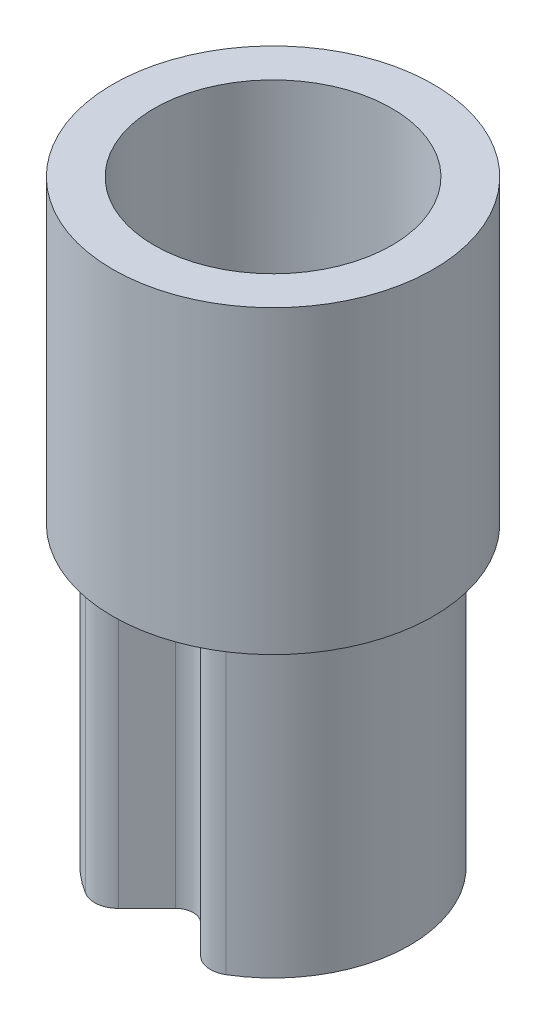
ISO-10303-21;
HEADER;
FILE_DESCRIPTION(('STEP AP214'),'2;1');
FILE_NAME('part.step','',(''),(''),'','','');
FILE_SCHEMA(('AUTOMOTIVE_DESIGN { 1 0 10303 214 1 1 1 1 }'));
ENDSEC;
DATA;
#1=APPLICATION_CONTEXT('core data for automotive mechanical design processes');
#2=APPLICATION_PROTOCOL_DEFINITION('international standard','automotive_design',2000,#1);
#3=PRODUCT_CONTEXT('',#1,'mechanical');
#4=PRODUCT('Part','Part','',(#3));
#5=PRODUCT_RELATED_PRODUCT_CATEGORY('part','',(#4));
#6=PRODUCT_DEFINITION_FORMATION('','',#4);
#7=PRODUCT_DEFINITION_CONTEXT('part definition',#1,'design');
#8=PRODUCT_DEFINITION('design','',#6,#7);
#9=PRODUCT_DEFINITION_SHAPE('','',#8);
#10=(LENGTH_UNIT() NAMED_UNIT(*) SI_UNIT(.MILLI.,.METRE.));
#11=(NAMED_UNIT(*) PLANE_ANGLE_UNIT() SI_UNIT($,.RADIAN.));
#12=(NAMED_UNIT(*) SI_UNIT($,.STERADIAN.) SOLID_ANGLE_UNIT());
#13=UNCERTAINTY_MEASURE_WITH_UNIT(LENGTH_MEASURE(1.E-05),#10,'distance_accuracy_value','');
#14=(GEOMETRIC_REPRESENTATION_CONTEXT(3) GLOBAL_UNCERTAINTY_ASSIGNED_CONTEXT((#13)) GLOBAL_UNIT_ASSIGNED_CONTEXT((#10,
#11,#12)) REPRESENTATION_CONTEXT('',''));
#15=CARTESIAN_POINT('',(0.,0.,0.));
#16=DIRECTION('',(0.,0.,1.));
#17=DIRECTION('',(1.,0.,0.));
#18=AXIS2_PLACEMENT_3D('',#15,#16,#17);
#19=CARTESIAN_POINT('',(0.,2.5,0.822132034355964));
#20=DIRECTION('',(0.,1.,0.));
#21=DIRECTION('',(0.,0.,1.));
#22=AXIS2_PLACEMENT_3D('',#19,#20,#21);
#23=PLANE('',#22);
#24=DIRECTION('',(0.707106781186548,0.,0.707106781186548));
#25=VECTOR('',#24,1.);
#26=CARTESIAN_POINT('',(0.106066017177983,2.5,0.716066017177983));
#27=LINE('',#26,#25);
#28=CARTESIAN_POINT('',(0.106066017177983,2.5,0.716066017177983));
#29=VERTEX_POINT('',#28);
#30=CARTESIAN_POINT('',(0.332945922473057,2.5,0.942945922473057));
#31=VERTEX_POINT('',#30);
#32=EDGE_CURVE('E155',#29,#31,#27,.T.);
#33=ORIENTED_EDGE('',*,*,#32,.T.);
#34=CARTESIAN_POINT('',(0.,2.5,0.));
#35=DIRECTION('',(0.,1.,0.));
#36=DIRECTION('',(0.,0.,1.));
#37=AXIS2_PLACEMENT_3D('',#34,#35,#36);
#38=CIRCLE('',#37,1.);
#39=CARTESIAN_POINT('',(0.513633561053512,2.5,0.858009653185492));
#40=VERTEX_POINT('',#39);
#41=EDGE_CURVE('E138',#31,#40,#38,.T.);
#42=ORIENTED_EDGE('',*,*,#41,.T.);
#43=CARTESIAN_POINT('',(0.487951883000837,2.5,0.815109170526217));
#44=DIRECTION('',(0.,1.,0.));
#45=DIRECTION('',(0.,0.,1.));
#46=AXIS2_PLACEMENT_3D('',#43,#44,#45);
#47=CIRCLE('',#46,0.05);
#48=CARTESIAN_POINT('',(0.452596543941509,2.5,0.850464509585545));
#49=VERTEX_POINT('',#48);
#50=EDGE_CURVE('E195',#40,#49,#47,.F.);
#51=ORIENTED_EDGE('',*,*,#50,.T.);
#52=DIRECTION('',(0.707106781186548,0.,0.707106781186547));
#53=VECTOR('',#52,1.);
#54=CARTESIAN_POINT('',(0.212132034355966,2.5,0.610000000000001));
#55=LINE('',#54,#53);
#56=CARTESIAN_POINT('',(0.212132034355966,2.5,0.610000000000002));
#57=VERTEX_POINT('',#56);
#58=EDGE_CURVE('E228',#57,#49,#55,.T.);
#59=ORIENTED_EDGE('',*,*,#58,.F.);
#60=CARTESIAN_POINT('',(0.,2.5,0.822132034355964));
#61=DIRECTION('',(0.,-1.,0.));
#62=DIRECTION('',(0.,0.,1.));
#63=AXIS2_PLACEMENT_3D('',#60,#61,#62);
#64=CIRCLE('',#63,0.3);
#65=CARTESIAN_POINT('',(-0.212132034355965,2.5,0.610000000000001));
#66=VERTEX_POINT('',#65);
#67=EDGE_CURVE('E224',#66,#57,#64,.T.);
#68=ORIENTED_EDGE('',*,*,#67,.F.);
#69=DIRECTION('',(0.707106781186547,0.,-0.707106781186548));
#70=VECTOR('',#69,1.);
#71=CARTESIAN_POINT('',(-0.479612456619358,2.5,0.877480422263394));
#72=LINE('',#71,#70);
#73=CARTESIAN_POINT('',(-0.452596543941509,2.5,0.850464509585545));
#74=VERTEX_POINT('',#73);
#75=EDGE_CURVE('E222',#74,#66,#72,.T.);
#76=ORIENTED_EDGE('',*,*,#75,.F.);
#77=CARTESIAN_POINT('',(-0.487951883000836,2.5,0.815109170526218));
#78=DIRECTION('',(0.,1.,0.));
#79=DIRECTION('',(0.,0.,1.));
#80=AXIS2_PLACEMENT_3D('',#77,#78,#79);
#81=CIRCLE('',#80,0.05);
#82=CARTESIAN_POINT('',(-0.513633561053512,2.5,0.858009653185492));
#83=VERTEX_POINT('',#82);
#84=EDGE_CURVE('E198',#74,#83,#81,.F.);
#85=ORIENTED_EDGE('',*,*,#84,.T.);
#86=CARTESIAN_POINT('',(-0.332945922473057,2.5,0.942945922473057));
#87=VERTEX_POINT('',#86);
#88=EDGE_CURVE('E12',#83,#87,#38,.T.);
#89=ORIENTED_EDGE('',*,*,#88,.T.);
#90=DIRECTION('',(0.707106781186547,0.,-0.707106781186548));
#91=VECTOR('',#90,1.);
#92=CARTESIAN_POINT('',(-0.448807004477936,2.5,1.05880700447794));
#93=LINE('',#92,#91);
#94=CARTESIAN_POINT('',(-0.106066017177983,2.5,0.716066017177983));
#95=VERTEX_POINT('',#94);
#96=EDGE_CURVE('E165',#87,#95,#93,.T.);
#97=ORIENTED_EDGE('',*,*,#96,.T.);
#98=CARTESIAN_POINT('',(0.,2.5,0.822132034355964));
#99=DIRECTION('',(0.,-1.,0.));
#100=DIRECTION('',(0.,0.,1.));
#101=AXIS2_PLACEMENT_3D('',#98,#99,#100);
#102=CIRCLE('',#101,0.15);
#103=EDGE_CURVE('E160',#95,#29,#102,.T.);
#104=ORIENTED_EDGE('',*,*,#103,.T.);
#105=EDGE_LOOP('',(#33,#42,#51,#59,#68,#76,#85,#89,#97,#104));
#106=FACE_BOUND('',#105,.T.);
#107=ADVANCED_FACE('F37',(#106),#23,.T.);
#108=CARTESIAN_POINT('',(0.,0.,0.822132034355964));
#109=DIRECTION('',(0.,1.,0.));
#110=DIRECTION('',(0.,0.,1.));
#111=AXIS2_PLACEMENT_3D('',#108,#109,#110);
#112=PLANE('',#111);
#113=CARTESIAN_POINT('',(0.,0.,0.));
#114=DIRECTION('',(0.,1.,0.));
#115=DIRECTION('',(0.,0.,1.));
#116=AXIS2_PLACEMENT_3D('',#113,#114,#115);
#117=CIRCLE('',#116,1.15);
#118=CARTESIAN_POINT('',(0.590678595211539,0.,0.986711101163316));
#119=VERTEX_POINT('',#118);
#120=CARTESIAN_POINT('',(-0.590678595211538,0.,0.986711101163316));
#121=VERTEX_POINT('',#120);
#122=EDGE_CURVE('E178',#119,#121,#117,.T.);
#123=ORIENTED_EDGE('',*,*,#122,.F.);
#124=CARTESIAN_POINT('',(0.487951883000836,0.,0.815109170526217));
#125=DIRECTION('',(0.,1.,0.));
#126=DIRECTION('',(0.,0.,1.));
#127=AXIS2_PLACEMENT_3D('',#124,#125,#126);
#128=CIRCLE('',#127,0.2);
#129=CARTESIAN_POINT('',(0.346530526763527,0.,0.956530526763527));
#130=VERTEX_POINT('',#129);
#131=EDGE_CURVE('E62',#119,#130,#128,.F.);
#132=ORIENTED_EDGE('',*,*,#131,.T.);
#133=DIRECTION('',(0.707106781186548,0.,0.707106781186548));
#134=VECTOR('',#133,1.);
#135=CARTESIAN_POINT('',(0.106066017177983,0.,0.716066017177983));
#136=LINE('',#135,#134);
#137=CARTESIAN_POINT('',(0.106066017177983,0.,0.716066017177983));
#138=VERTEX_POINT('',#137);
#139=EDGE_CURVE('E175',#138,#130,#136,.T.);
#140=ORIENTED_EDGE('',*,*,#139,.F.);
#141=CARTESIAN_POINT('',(0.,0.,0.822132034355964));
#142=DIRECTION('',(0.,-1.,0.));
#143=DIRECTION('',(0.,0.,1.));
#144=AXIS2_PLACEMENT_3D('',#141,#142,#143);
#145=CIRCLE('',#144,0.15);
#146=CARTESIAN_POINT('',(-0.106066017177983,0.,0.716066017177983));
#147=VERTEX_POINT('',#146);
#148=EDGE_CURVE('E172',#147,#138,#145,.T.);
#149=ORIENTED_EDGE('',*,*,#148,.F.);
#150=DIRECTION('',(0.707106781186547,0.,-0.707106781186548));
#151=VECTOR('',#150,1.);
#152=CARTESIAN_POINT('',(-0.448807004477936,0.,1.05880700447794));
#153=LINE('',#152,#151);
#154=CARTESIAN_POINT('',(-0.346530526763527,0.,0.956530526763527));
#155=VERTEX_POINT('',#154);
#156=EDGE_CURVE('E181',#155,#147,#153,.T.);
#157=ORIENTED_EDGE('',*,*,#156,.F.);
#158=CARTESIAN_POINT('',(-0.487951883000836,0.,0.815109170526218));
#159=DIRECTION('',(0.,1.,0.));
#160=DIRECTION('',(0.,0.,1.));
#161=AXIS2_PLACEMENT_3D('',#158,#159,#160);
#162=CIRCLE('',#161,0.2);
#163=EDGE_CURVE('E205',#155,#121,#162,.F.);
#164=ORIENTED_EDGE('',*,*,#163,.T.);
#165=EDGE_LOOP('',(#123,#132,#140,#149,#157,#164));
#166=FACE_BOUND('',#165,.T.);
#167=DIRECTION('',(0.707106781186548,0.,0.707106781186547));
#168=VECTOR('',#167,1.);
#169=CARTESIAN_POINT('',(0.212132034355966,0.,0.610000000000001));
#170=LINE('',#169,#168);
#171=CARTESIAN_POINT('',(0.212132034355966,0.,0.610000000000002));
#172=VERTEX_POINT('',#171);
#173=CARTESIAN_POINT('',(0.452596543941509,0.,0.850464509585545));
#174=VERTEX_POINT('',#173);
#175=EDGE_CURVE('E225',#172,#174,#170,.T.);
#176=ORIENTED_EDGE('',*,*,#175,.T.);
#177=CARTESIAN_POINT('',(0.487951883000837,0.,0.815109170526217));
#178=DIRECTION('',(0.,1.,0.));
#179=DIRECTION('',(0.,0.,1.));
#180=AXIS2_PLACEMENT_3D('',#177,#178,#179);
#181=CIRCLE('',#180,0.05);
#182=CARTESIAN_POINT('',(0.513633561053512,0.,0.858009653185492));
#183=VERTEX_POINT('',#182);
#184=EDGE_CURVE('E193',#174,#183,#181,.T.);
#185=ORIENTED_EDGE('',*,*,#184,.T.);
#186=CARTESIAN_POINT('',(0.,0.,0.));
#187=DIRECTION('',(0.,1.,0.));
#188=DIRECTION('',(0.,0.,1.));
#189=AXIS2_PLACEMENT_3D('',#186,#187,#188);
#190=CIRCLE('',#189,1.);
#191=CARTESIAN_POINT('',(-0.513633561053512,0.,0.858009653185492));
#192=VERTEX_POINT('',#191);
#193=EDGE_CURVE('E232',#183,#192,#190,.T.);
#194=ORIENTED_EDGE('',*,*,#193,.T.);
#195=CARTESIAN_POINT('',(-0.487951883000836,0.,0.815109170526218));
#196=DIRECTION('',(0.,1.,0.));
#197=DIRECTION('',(0.,0.,1.));
#198=AXIS2_PLACEMENT_3D('',#195,#196,#197);
#199=CIRCLE('',#198,0.05);
#200=CARTESIAN_POINT('',(-0.452596543941509,0.,0.850464509585545));
#201=VERTEX_POINT('',#200);
#202=EDGE_CURVE('E196',#192,#201,#199,.T.);
#203=ORIENTED_EDGE('',*,*,#202,.T.);
#204=DIRECTION('',(0.707106781186547,0.,-0.707106781186548));
#205=VECTOR('',#204,1.);
#206=CARTESIAN_POINT('',(-0.479612456619358,0.,0.877480422263394));
#207=LINE('',#206,#205);
#208=CARTESIAN_POINT('',(-0.212132034355965,0.,0.610000000000001));
#209=VERTEX_POINT('',#208);
#210=EDGE_CURVE('E235',#201,#209,#207,.T.);
#211=ORIENTED_EDGE('',*,*,#210,.T.);
#212=CARTESIAN_POINT('',(0.,0.,0.822132034355964));
#213=DIRECTION('',(0.,-1.,0.));
#214=DIRECTION('',(0.,0.,1.));
#215=AXIS2_PLACEMENT_3D('',#212,#213,#214);
#216=CIRCLE('',#215,0.3);
#217=EDGE_CURVE('E238',#209,#172,#216,.T.);
#218=ORIENTED_EDGE('',*,*,#217,.T.);
#219=EDGE_LOOP('',(#176,#185,#194,#203,#211,#218));
#220=FACE_BOUND('',#219,.T.);
#221=ADVANCED_FACE('F256',(#166,#220),#112,.F.);
#222=CARTESIAN_POINT('',(0.,2.5,0.822132034355964));
#223=DIRECTION('',(0.,-1.,0.));
#224=DIRECTION('',(0.,0.,-1.));
#225=AXIS2_PLACEMENT_3D('',#222,#223,#224);
#226=CYLINDRICAL_SURFACE('',#225,0.15);
#227=ORIENTED_EDGE('',*,*,#148,.T.);
#228=DIRECTION('',(0.,-1.,0.));
#229=VECTOR('',#228,1.);
#230=CARTESIAN_POINT('',(0.106066017177983,2.5,0.716066017177983));
#231=LINE('',#230,#229);
#232=EDGE_CURVE('E185',#29,#138,#231,.T.);
#233=ORIENTED_EDGE('',*,*,#232,.F.);
#234=ORIENTED_EDGE('',*,*,#103,.F.);
#235=DIRECTION('',(0.,-1.,0.));
#236=VECTOR('',#235,1.);
#237=CARTESIAN_POINT('',(-0.106066017177983,2.5,0.716066017177983));
#238=LINE('',#237,#236);
#239=EDGE_CURVE('E171',#95,#147,#238,.T.);
#240=ORIENTED_EDGE('',*,*,#239,.T.);
#241=EDGE_LOOP('',(#227,#233,#234,#240));
#242=FACE_BOUND('',#241,.T.);
#243=ADVANCED_FACE('F292',(#242),#226,.F.);
#244=CARTESIAN_POINT('',(0.106066017177983,2.5,0.716066017177983));
#245=DIRECTION('',(0.707106781186547,0.,-0.707106781186547));
#246=DIRECTION('',(-0.707106781186548,0.,-0.707106781186548));
#247=AXIS2_PLACEMENT_3D('',#244,#245,#246);
#248=PLANE('',#247);
#249=ORIENTED_EDGE('',*,*,#139,.T.);
#250=DIRECTION('',(0.,-1.,0.));
#251=VECTOR('',#250,1.);
#252=CARTESIAN_POINT('',(0.346530526763527,2.5,0.956530526763527));
#253=LINE('',#252,#251);
#254=CARTESIAN_POINT('',(0.346530526763527,2.5,0.956530526763527));
#255=VERTEX_POINT('',#254);
#256=EDGE_CURVE('E158',#130,#255,#253,.F.);
#257=ORIENTED_EDGE('',*,*,#256,.T.);
#258=EDGE_CURVE('E134',#31,#255,#27,.T.);
#259=ORIENTED_EDGE('',*,*,#258,.F.);
#260=ORIENTED_EDGE('',*,*,#32,.F.);
#261=ORIENTED_EDGE('',*,*,#232,.T.);
#262=EDGE_LOOP('',(#249,#257,#259,#260,#261));
#263=FACE_BOUND('',#262,.T.);
#264=ADVANCED_FACE('F153',(#263),#248,.F.);
#265=CARTESIAN_POINT('',(0.,2.5,0.));
#266=DIRECTION('',(0.,-1.,0.));
#267=DIRECTION('',(0.,0.,-1.));
#268=AXIS2_PLACEMENT_3D('',#265,#266,#267);
#269=CYLINDRICAL_SURFACE('',#268,1.15);
#270=CARTESIAN_POINT('',(0.,2.5,0.));
#271=DIRECTION('',(0.,1.,0.));
#272=DIRECTION('',(0.,0.,1.));
#273=AXIS2_PLACEMENT_3D('',#270,#271,#272);
#274=CIRCLE('',#273,1.15);
#275=CARTESIAN_POINT('',(0.590678595211539,2.5,0.986711101163316));
#276=VERTEX_POINT('',#275);
#277=CARTESIAN_POINT('',(-0.590678595211538,2.5,0.986711101163316));
#278=VERTEX_POINT('',#277);
#279=EDGE_CURVE('E164',#276,#278,#274,.T.);
#280=ORIENTED_EDGE('',*,*,#279,.F.);
#281=DIRECTION('',(0.,-1.,0.));
#282=VECTOR('',#281,1.);
#283=CARTESIAN_POINT('',(0.590678595211539,2.5,0.986711101163316));
#284=LINE('',#283,#282);
#285=EDGE_CURVE('E202',#276,#119,#284,.T.);
#286=ORIENTED_EDGE('',*,*,#285,.T.);
#287=ORIENTED_EDGE('',*,*,#122,.T.);
#288=DIRECTION('',(0.,-1.,0.));
#289=VECTOR('',#288,1.);
#290=CARTESIAN_POINT('',(-0.590678595211539,2.5,0.986711101163316));
#291=LINE('',#290,#289);
#292=EDGE_CURVE('E199',#121,#278,#291,.F.);
#293=ORIENTED_EDGE('',*,*,#292,.T.);
#294=EDGE_LOOP('',(#280,#286,#287,#293));
#295=FACE_BOUND('',#294,.T.);
#296=ADVANCED_FACE('F300',(#295),#269,.T.);
#297=CARTESIAN_POINT('',(-0.448807004477936,2.5,1.05880700447794));
#298=DIRECTION('',(-0.707106781186548,0.,-0.707106781186547));
#299=DIRECTION('',(-0.707106781186547,0.,0.707106781186548));
#300=AXIS2_PLACEMENT_3D('',#297,#298,#299);
#301=PLANE('',#300);
#302=CARTESIAN_POINT('',(-0.346530526763527,2.5,0.956530526763527));
#303=VERTEX_POINT('',#302);
#304=EDGE_CURVE('E137',#303,#87,#93,.T.);
#305=ORIENTED_EDGE('',*,*,#304,.F.);
#306=DIRECTION('',(0.,-1.,0.));
#307=VECTOR('',#306,1.);
#308=CARTESIAN_POINT('',(-0.346530526763527,2.5,0.956530526763527));
#309=LINE('',#308,#307);
#310=EDGE_CURVE('E46',#303,#155,#309,.T.);
#311=ORIENTED_EDGE('',*,*,#310,.T.);
#312=ORIENTED_EDGE('',*,*,#156,.T.);
#313=ORIENTED_EDGE('',*,*,#239,.F.);
#314=ORIENTED_EDGE('',*,*,#96,.F.);
#315=EDGE_LOOP('',(#305,#311,#312,#313,#314));
#316=FACE_BOUND('',#315,.T.);
#317=ADVANCED_FACE('F297',(#316),#301,.F.);
#318=CARTESIAN_POINT('',(0.,2.5,0.));
#319=DIRECTION('',(0.,-1.,0.));
#320=DIRECTION('',(0.,0.,-1.));
#321=AXIS2_PLACEMENT_3D('',#318,#319,#320);
#322=CYLINDRICAL_SURFACE('',#321,1.);
#323=ORIENTED_EDGE('',*,*,#193,.F.);
#324=DIRECTION('',(0.,-1.,0.));
#325=VECTOR('',#324,1.);
#326=CARTESIAN_POINT('',(0.513633561053512,2.5,0.858009653185492));
#327=LINE('',#326,#325);
#328=EDGE_CURVE('E146',#183,#40,#327,.F.);
#329=ORIENTED_EDGE('',*,*,#328,.T.);
#330=ORIENTED_EDGE('',*,*,#41,.F.);
#331=EDGE_CURVE('E54',#87,#31,#38,.T.);
#332=ORIENTED_EDGE('',*,*,#331,.F.);
#333=ORIENTED_EDGE('',*,*,#88,.F.);
#334=DIRECTION('',(0.,-1.,0.));
#335=VECTOR('',#334,1.);
#336=CARTESIAN_POINT('',(-0.513633561053512,2.5,0.858009653185492));
#337=LINE('',#336,#335);
#338=EDGE_CURVE('E190',#83,#192,#337,.T.);
#339=ORIENTED_EDGE('',*,*,#338,.T.);
#340=EDGE_LOOP('',(#323,#329,#330,#332,#333,#339));
#341=FACE_BOUND('',#340,.T.);
#342=CARTESIAN_POINT('',(0.,5.03,0.));
#343=DIRECTION('',(0.,1.,0.));
#344=DIRECTION('',(0.,0.,1.));
#345=AXIS2_PLACEMENT_3D('',#342,#343,#344);
#346=CIRCLE('',#345,1.);
#347=CARTESIAN_POINT('',(0.,5.03,1.));
#348=VERTEX_POINT('',#347);
#349=EDGE_CURVE('E139',#348,#348,#346,.T.);
#350=ORIENTED_EDGE('',*,*,#349,.T.);
#351=EDGE_LOOP('',(#350));
#352=FACE_BOUND('',#351,.T.);
#353=ADVANCED_FACE('F143',(#341,#352),#322,.F.);
#354=CARTESIAN_POINT('',(-0.479612456619358,2.5,0.877480422263394));
#355=DIRECTION('',(-0.707106781186548,0.,-0.707106781186547));
#356=DIRECTION('',(-0.707106781186547,0.,0.707106781186548));
#357=AXIS2_PLACEMENT_3D('',#354,#355,#356);
#358=PLANE('',#357);
#359=ORIENTED_EDGE('',*,*,#210,.F.);
#360=DIRECTION('',(0.,1.,0.));
#361=VECTOR('',#360,1.);
#362=CARTESIAN_POINT('',(-0.452596543941509,2.5,0.850464509585545));
#363=LINE('',#362,#361);
#364=EDGE_CURVE('E191',#201,#74,#363,.T.);
#365=ORIENTED_EDGE('',*,*,#364,.T.);
#366=ORIENTED_EDGE('',*,*,#75,.T.);
#367=DIRECTION('',(0.,-1.,0.));
#368=VECTOR('',#367,1.);
#369=CARTESIAN_POINT('',(-0.212132034355965,2.5,0.610000000000001));
#370=LINE('',#369,#368);
#371=EDGE_CURVE('E176',#66,#209,#370,.T.);
#372=ORIENTED_EDGE('',*,*,#371,.T.);
#373=EDGE_LOOP('',(#359,#365,#366,#372));
#374=FACE_BOUND('',#373,.T.);
#375=ADVANCED_FACE('F248',(#374),#358,.T.);
#376=CARTESIAN_POINT('',(0.,2.5,0.822132034355964));
#377=DIRECTION('',(0.,-1.,0.));
#378=DIRECTION('',(0.,0.,-1.));
#379=AXIS2_PLACEMENT_3D('',#376,#377,#378);
#380=CYLINDRICAL_SURFACE('',#379,0.3);
#381=ORIENTED_EDGE('',*,*,#217,.F.);
#382=ORIENTED_EDGE('',*,*,#371,.F.);
#383=ORIENTED_EDGE('',*,*,#67,.T.);
#384=DIRECTION('',(0.,-1.,0.));
#385=VECTOR('',#384,1.);
#386=CARTESIAN_POINT('',(0.212132034355966,2.5,0.610000000000002));
#387=LINE('',#386,#385);
#388=EDGE_CURVE('E231',#57,#172,#387,.T.);
#389=ORIENTED_EDGE('',*,*,#388,.T.);
#390=EDGE_LOOP('',(#381,#382,#383,#389));
#391=FACE_BOUND('',#390,.T.);
#392=ADVANCED_FACE('F253',(#391),#380,.T.);
#393=CARTESIAN_POINT('',(0.212132034355966,2.5,0.610000000000001));
#394=DIRECTION('',(0.707106781186547,0.,-0.707106781186548));
#395=DIRECTION('',(-0.707106781186548,0.,-0.707106781186547));
#396=AXIS2_PLACEMENT_3D('',#393,#394,#395);
#397=PLANE('',#396);
#398=ORIENTED_EDGE('',*,*,#58,.T.);
#399=DIRECTION('',(0.,1.,0.));
#400=VECTOR('',#399,1.);
#401=CARTESIAN_POINT('',(0.452596543941509,0.,0.850464509585545));
#402=LINE('',#401,#400);
#403=EDGE_CURVE('E187',#49,#174,#402,.F.);
#404=ORIENTED_EDGE('',*,*,#403,.T.);
#405=ORIENTED_EDGE('',*,*,#175,.F.);
#406=ORIENTED_EDGE('',*,*,#388,.F.);
#407=EDGE_LOOP('',(#398,#404,#405,#406));
#408=FACE_BOUND('',#407,.T.);
#409=ADVANCED_FACE('F275',(#408),#397,.T.);
#410=CARTESIAN_POINT('',(0.487951883000837,2.5,0.815109170526217));
#411=DIRECTION('',(0.,-1.,0.));
#412=DIRECTION('',(0.,0.,-1.));
#413=AXIS2_PLACEMENT_3D('',#410,#411,#412);
#414=CYLINDRICAL_SURFACE('',#413,0.05);
#415=ORIENTED_EDGE('',*,*,#50,.F.);
#416=ORIENTED_EDGE('',*,*,#328,.F.);
#417=ORIENTED_EDGE('',*,*,#184,.F.);
#418=ORIENTED_EDGE('',*,*,#403,.F.);
#419=EDGE_LOOP('',(#415,#416,#417,#418));
#420=FACE_BOUND('',#419,.T.);
#421=ADVANCED_FACE('F276',(#420),#414,.F.);
#422=CARTESIAN_POINT('',(-0.487951883000836,2.5,0.815109170526218));
#423=DIRECTION('',(0.,-1.,0.));
#424=DIRECTION('',(0.,0.,-1.));
#425=AXIS2_PLACEMENT_3D('',#422,#423,#424);
#426=CYLINDRICAL_SURFACE('',#425,0.05);
#427=ORIENTED_EDGE('',*,*,#84,.F.);
#428=ORIENTED_EDGE('',*,*,#364,.F.);
#429=ORIENTED_EDGE('',*,*,#202,.F.);
#430=ORIENTED_EDGE('',*,*,#338,.F.);
#431=EDGE_LOOP('',(#427,#428,#429,#430));
#432=FACE_BOUND('',#431,.T.);
#433=ADVANCED_FACE('F261',(#432),#426,.F.);
#434=CARTESIAN_POINT('',(0.487951883000836,2.5,0.815109170526217));
#435=DIRECTION('',(0.,-1.,0.));
#436=DIRECTION('',(0.,0.,-1.));
#437=AXIS2_PLACEMENT_3D('',#434,#435,#436);
#438=CYLINDRICAL_SURFACE('',#437,0.2);
#439=CARTESIAN_POINT('',(0.487951883000836,2.5,0.815109170526217));
#440=DIRECTION('',(0.,1.,0.));
#441=DIRECTION('',(0.,0.,1.));
#442=AXIS2_PLACEMENT_3D('',#439,#440,#441);
#443=CIRCLE('',#442,0.2);
#444=EDGE_CURVE('E211',#255,#276,#443,.T.);
#445=ORIENTED_EDGE('',*,*,#444,.F.);
#446=ORIENTED_EDGE('',*,*,#256,.F.);
#447=ORIENTED_EDGE('',*,*,#131,.F.);
#448=ORIENTED_EDGE('',*,*,#285,.F.);
#449=EDGE_LOOP('',(#445,#446,#447,#448));
#450=FACE_BOUND('',#449,.T.);
#451=ADVANCED_FACE('F283',(#450),#438,.T.);
#452=CARTESIAN_POINT('',(-0.487951883000836,2.5,0.815109170526218));
#453=DIRECTION('',(0.,-1.,0.));
#454=DIRECTION('',(0.,0.,-1.));
#455=AXIS2_PLACEMENT_3D('',#452,#453,#454);
#456=CYLINDRICAL_SURFACE('',#455,0.2);
#457=CARTESIAN_POINT('',(-0.487951883000836,2.5,0.815109170526218));
#458=DIRECTION('',(0.,1.,0.));
#459=DIRECTION('',(0.,0.,1.));
#460=AXIS2_PLACEMENT_3D('',#457,#458,#459);
#461=CIRCLE('',#460,0.2);
#462=EDGE_CURVE('E209',#278,#303,#461,.T.);
#463=ORIENTED_EDGE('',*,*,#462,.F.);
#464=ORIENTED_EDGE('',*,*,#292,.F.);
#465=ORIENTED_EDGE('',*,*,#163,.F.);
#466=ORIENTED_EDGE('',*,*,#310,.F.);
#467=EDGE_LOOP('',(#463,#464,#465,#466));
#468=FACE_BOUND('',#467,.T.);
#469=ADVANCED_FACE('F39',(#468),#456,.T.);
#470=CARTESIAN_POINT('',(0.,2.5,0.));
#471=DIRECTION('',(0.,1.,0.));
#472=DIRECTION('',(0.,0.,1.));
#473=AXIS2_PLACEMENT_3D('',#470,#471,#472);
#474=PLANE('',#473);
#475=CARTESIAN_POINT('',(0.,2.5,0.));
#476=DIRECTION('',(0.,1.,0.));
#477=DIRECTION('',(0.,0.,1.));
#478=AXIS2_PLACEMENT_3D('',#475,#476,#477);
#479=CIRCLE('',#478,1.35);
#480=CARTESIAN_POINT('',(0.,2.5,1.35));
#481=VERTEX_POINT('',#480);
#482=EDGE_CURVE('E150',#481,#481,#479,.T.);
#483=ORIENTED_EDGE('',*,*,#482,.F.);
#484=EDGE_LOOP('',(#483));
#485=FACE_BOUND('',#484,.T.);
#486=ORIENTED_EDGE('',*,*,#331,.T.);
#487=ORIENTED_EDGE('',*,*,#258,.T.);
#488=ORIENTED_EDGE('',*,*,#444,.T.);
#489=ORIENTED_EDGE('',*,*,#279,.T.);
#490=ORIENTED_EDGE('',*,*,#462,.T.);
#491=ORIENTED_EDGE('',*,*,#304,.T.);
#492=EDGE_LOOP('',(#486,#487,#488,#489,#490,#491));
#493=FACE_BOUND('',#492,.T.);
#494=ADVANCED_FACE('F132',(#485,#493),#474,.F.);
#495=CARTESIAN_POINT('',(0.,13.8783766184074,0.));
#496=DIRECTION('',(0.,-1.,0.));
#497=DIRECTION('',(0.,0.,-1.));
#498=AXIS2_PLACEMENT_3D('',#495,#496,#497);
#499=CYLINDRICAL_SURFACE('',#498,1.35);
#500=ORIENTED_EDGE('',*,*,#482,.T.);
#501=EDGE_LOOP('',(#500));
#502=FACE_BOUND('',#501,.T.);
#503=CARTESIAN_POINT('',(0.,5.03,0.));
#504=DIRECTION('',(0.,1.,0.));
#505=DIRECTION('',(0.,0.,1.));
#506=AXIS2_PLACEMENT_3D('',#503,#504,#505);
#507=CIRCLE('',#506,1.35);
#508=CARTESIAN_POINT('',(0.,5.03,1.35));
#509=VERTEX_POINT('',#508);
#510=EDGE_CURVE('E236',#509,#509,#507,.T.);
#511=ORIENTED_EDGE('',*,*,#510,.F.);
#512=EDGE_LOOP('',(#511));
#513=FACE_BOUND('',#512,.T.);
#514=ADVANCED_FACE('F326',(#502,#513),#499,.T.);
#515=CARTESIAN_POINT('',(0.,5.03,0.822132034355964));
#516=DIRECTION('',(0.,1.,0.));
#517=DIRECTION('',(0.,0.,1.));
#518=AXIS2_PLACEMENT_3D('',#515,#516,#517);
#519=PLANE('',#518);
#520=ORIENTED_EDGE('',*,*,#349,.F.);
#521=EDGE_LOOP('',(#520));
#522=FACE_BOUND('',#521,.T.);
#523=ORIENTED_EDGE('',*,*,#510,.T.);
#524=EDGE_LOOP('',(#523));
#525=FACE_BOUND('',#524,.T.);
#526=ADVANCED_FACE('F408',(#522,#525),#519,.T.);
#527=CLOSED_SHELL('',(#107,#221,#243,#264,#296,#317,#353,#375,#392,#409,#421,#433,#451,#469,
#494,#514,#526));
#528=MANIFOLD_SOLID_BREP('B2',#527);
#529=ADVANCED_BREP_SHAPE_REPRESENTATION('',(#18,#528),#14);
#530=SHAPE_DEFINITION_REPRESENTATION(#9,#529);
ENDSEC;
END-ISO-10303-21;
